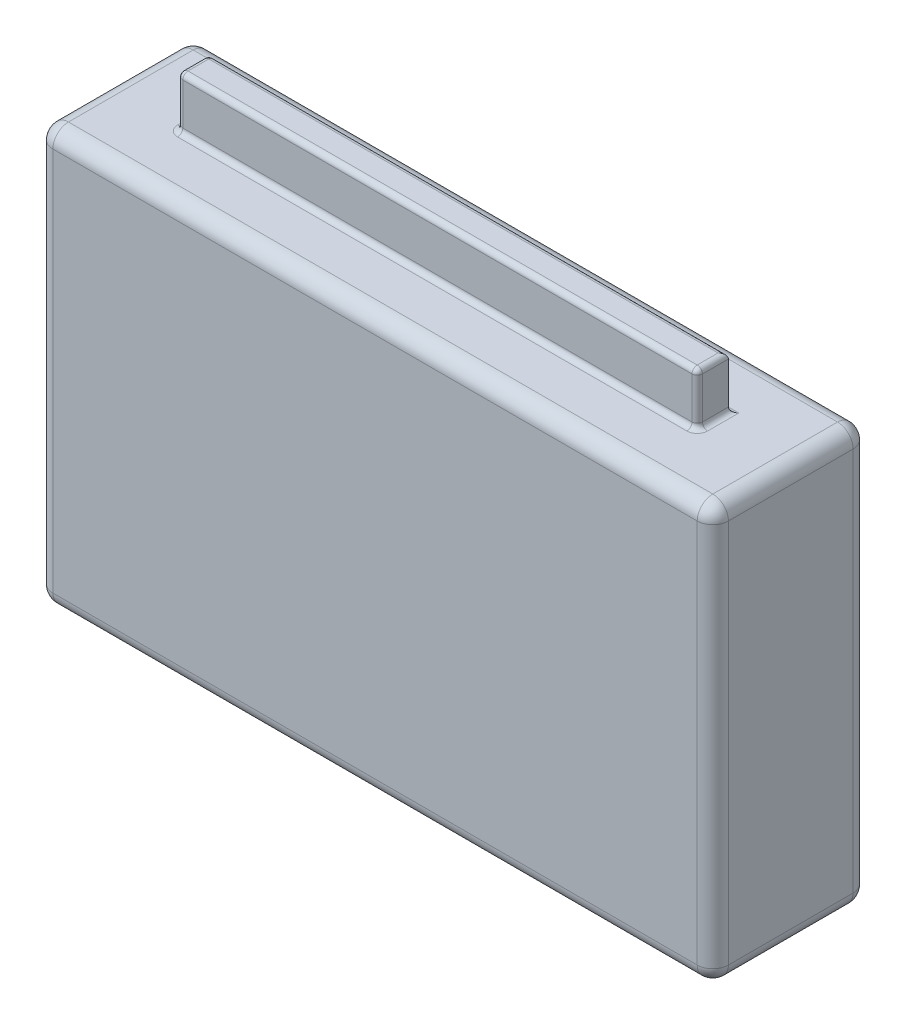
ISO-10303-21;
HEADER;
FILE_DESCRIPTION(('STEP AP214'),'2;1');
FILE_NAME('part.step','',(''),(''),'','','');
FILE_SCHEMA(('AUTOMOTIVE_DESIGN { 1 0 10303 214 1 1 1 1 }'));
ENDSEC;
DATA;
#1=APPLICATION_CONTEXT('core data for automotive mechanical design processes');
#2=APPLICATION_PROTOCOL_DEFINITION('international standard','automotive_design',2000,#1);
#3=PRODUCT_CONTEXT('',#1,'mechanical');
#4=PRODUCT('Part','Part','',(#3));
#5=PRODUCT_RELATED_PRODUCT_CATEGORY('part','',(#4));
#6=PRODUCT_DEFINITION_FORMATION('','',#4);
#7=PRODUCT_DEFINITION_CONTEXT('part definition',#1,'design');
#8=PRODUCT_DEFINITION('design','',#6,#7);
#9=PRODUCT_DEFINITION_SHAPE('','',#8);
#10=(LENGTH_UNIT() NAMED_UNIT(*) SI_UNIT(.MILLI.,.METRE.));
#11=(NAMED_UNIT(*) PLANE_ANGLE_UNIT() SI_UNIT($,.RADIAN.));
#12=(NAMED_UNIT(*) SI_UNIT($,.STERADIAN.) SOLID_ANGLE_UNIT());
#13=UNCERTAINTY_MEASURE_WITH_UNIT(LENGTH_MEASURE(1.E-05),#10,'distance_accuracy_value','');
#14=(GEOMETRIC_REPRESENTATION_CONTEXT(3) GLOBAL_UNCERTAINTY_ASSIGNED_CONTEXT((#13)) GLOBAL_UNIT_ASSIGNED_CONTEXT((#10,
#11,#12)) REPRESENTATION_CONTEXT('',''));
#15=CARTESIAN_POINT('',(0.,0.,0.));
#16=DIRECTION('',(0.,0.,1.));
#17=DIRECTION('',(1.,0.,0.));
#18=AXIS2_PLACEMENT_3D('',#15,#16,#17);
#19=CARTESIAN_POINT('',(650.,400.,300.));
#20=DIRECTION('',(0.,-1.,0.));
#21=DIRECTION('',(1.,0.,0.));
#22=AXIS2_PLACEMENT_3D('',#19,#20,#21);
#23=PLANE('',#22);
#24=DIRECTION('',(-1.,0.,0.));
#25=VECTOR('',#24,1.);
#26=CARTESIAN_POINT('',(650.,400.,270.));
#27=LINE('',#26,#25);
#28=CARTESIAN_POINT('',(-620.,400.,270.));
#29=VERTEX_POINT('',#28);
#30=CARTESIAN_POINT('',(620.,400.,270.));
#31=VERTEX_POINT('',#30);
#32=EDGE_CURVE('E275',#29,#31,#27,.F.);
#33=ORIENTED_EDGE('',*,*,#32,.T.);
#34=DIRECTION('',(0.,0.,-1.));
#35=VECTOR('',#34,1.);
#36=CARTESIAN_POINT('',(620.,400.,300.));
#37=LINE('',#36,#35);
#38=CARTESIAN_POINT('',(620.,400.,30.));
#39=VERTEX_POINT('',#38);
#40=EDGE_CURVE('E281',#31,#39,#37,.T.);
#41=ORIENTED_EDGE('',*,*,#40,.T.);
#42=DIRECTION('',(-1.,0.,0.));
#43=VECTOR('',#42,1.);
#44=CARTESIAN_POINT('',(650.,400.,30.));
#45=LINE('',#44,#43);
#46=CARTESIAN_POINT('',(-620.,400.,30.));
#47=VERTEX_POINT('',#46);
#48=EDGE_CURVE('E279',#39,#47,#45,.T.);
#49=ORIENTED_EDGE('',*,*,#48,.T.);
#50=DIRECTION('',(0.,0.,-1.));
#51=VECTOR('',#50,1.);
#52=CARTESIAN_POINT('',(-620.,400.,300.));
#53=LINE('',#52,#51);
#54=EDGE_CURVE('E277',#47,#29,#53,.F.);
#55=ORIENTED_EDGE('',*,*,#54,.T.);
#56=EDGE_LOOP('',(#33,#41,#49,#55));
#57=FACE_BOUND('',#56,.T.);
#58=CARTESIAN_POINT('',(-490.,400.,130.));
#59=DIRECTION('',(0.,-1.,0.));
#60=DIRECTION('',(1.,0.,0.));
#61=AXIS2_PLACEMENT_3D('',#58,#59,#60);
#62=CIRCLE('',#61,20.);
#63=CARTESIAN_POINT('',(-490.,400.,110.));
#64=VERTEX_POINT('',#63);
#65=CARTESIAN_POINT('',(-510.,400.,130.));
#66=VERTEX_POINT('',#65);
#67=EDGE_CURVE('E360',#64,#66,#62,.F.);
#68=ORIENTED_EDGE('',*,*,#67,.F.);
#69=DIRECTION('',(-1.,0.,0.));
#70=VECTOR('',#69,1.);
#71=CARTESIAN_POINT('',(500.,400.,110.));
#72=LINE('',#71,#70);
#73=CARTESIAN_POINT('',(510.,400.,110.));
#74=VERTEX_POINT('',#73);
#75=EDGE_CURVE('E357',#64,#74,#72,.F.);
#76=ORIENTED_EDGE('',*,*,#75,.T.);
#77=DIRECTION('',(0.,0.,-1.));
#78=VECTOR('',#77,1.);
#79=CARTESIAN_POINT('',(510.,400.,180.));
#80=LINE('',#79,#78);
#81=CARTESIAN_POINT('',(510.,400.,170.));
#82=VERTEX_POINT('',#81);
#83=EDGE_CURVE('E355',#74,#82,#80,.F.);
#84=ORIENTED_EDGE('',*,*,#83,.T.);
#85=CARTESIAN_POINT('',(490.,400.,170.));
#86=DIRECTION('',(0.,-1.,0.));
#87=DIRECTION('',(1.,0.,0.));
#88=AXIS2_PLACEMENT_3D('',#85,#86,#87);
#89=CIRCLE('',#88,20.);
#90=CARTESIAN_POINT('',(490.,400.,190.));
#91=VERTEX_POINT('',#90);
#92=EDGE_CURVE('E352',#91,#82,#89,.F.);
#93=ORIENTED_EDGE('',*,*,#92,.F.);
#94=DIRECTION('',(1.,0.,0.));
#95=VECTOR('',#94,1.);
#96=CARTESIAN_POINT('',(-500.,400.,190.));
#97=LINE('',#96,#95);
#98=CARTESIAN_POINT('',(-490.,400.,190.));
#99=VERTEX_POINT('',#98);
#100=EDGE_CURVE('E348',#91,#99,#97,.F.);
#101=ORIENTED_EDGE('',*,*,#100,.T.);
#102=CARTESIAN_POINT('',(-490.,400.,170.));
#103=DIRECTION('',(0.,-1.,0.));
#104=DIRECTION('',(1.,0.,0.));
#105=AXIS2_PLACEMENT_3D('',#102,#103,#104);
#106=CIRCLE('',#105,20.);
#107=CARTESIAN_POINT('',(-510.,400.,170.));
#108=VERTEX_POINT('',#107);
#109=EDGE_CURVE('E345',#108,#99,#106,.F.);
#110=ORIENTED_EDGE('',*,*,#109,.F.);
#111=DIRECTION('',(0.,0.,1.));
#112=VECTOR('',#111,1.);
#113=CARTESIAN_POINT('',(-510.,400.,120.));
#114=LINE('',#113,#112);
#115=EDGE_CURVE('E350',#108,#66,#114,.F.);
#116=ORIENTED_EDGE('',*,*,#115,.T.);
#117=EDGE_LOOP('',(#68,#76,#84,#93,#101,#110,#116));
#118=FACE_BOUND('',#117,.T.);
#119=ADVANCED_FACE('F37',(#57,#118),#23,.F.);
#120=CARTESIAN_POINT('',(-650.,-400.,300.));
#121=DIRECTION('',(1.,0.,0.));
#122=DIRECTION('',(0.,0.,-1.));
#123=AXIS2_PLACEMENT_3D('',#120,#121,#122);
#124=PLANE('',#123);
#125=DIRECTION('',(0.,0.,-1.));
#126=VECTOR('',#125,1.);
#127=CARTESIAN_POINT('',(-650.,370.,300.));
#128=LINE('',#127,#126);
#129=CARTESIAN_POINT('',(-650.,370.,270.));
#130=VERTEX_POINT('',#129);
#131=CARTESIAN_POINT('',(-650.,370.,30.));
#132=VERTEX_POINT('',#131);
#133=EDGE_CURVE('E248',#130,#132,#128,.T.);
#134=ORIENTED_EDGE('',*,*,#133,.T.);
#135=DIRECTION('',(0.,-1.,0.));
#136=VECTOR('',#135,1.);
#137=CARTESIAN_POINT('',(-650.,-400.,30.));
#138=LINE('',#137,#136);
#139=CARTESIAN_POINT('',(-650.,-370.,30.));
#140=VERTEX_POINT('',#139);
#141=EDGE_CURVE('E254',#132,#140,#138,.T.);
#142=ORIENTED_EDGE('',*,*,#141,.T.);
#143=DIRECTION('',(0.,0.,-1.));
#144=VECTOR('',#143,1.);
#145=CARTESIAN_POINT('',(-650.,-370.,300.));
#146=LINE('',#145,#144);
#147=CARTESIAN_POINT('',(-650.,-370.,270.));
#148=VERTEX_POINT('',#147);
#149=EDGE_CURVE('E252',#140,#148,#146,.F.);
#150=ORIENTED_EDGE('',*,*,#149,.T.);
#151=DIRECTION('',(0.,-1.,0.));
#152=VECTOR('',#151,1.);
#153=CARTESIAN_POINT('',(-650.,400.,270.));
#154=LINE('',#153,#152);
#155=EDGE_CURVE('E250',#148,#130,#154,.F.);
#156=ORIENTED_EDGE('',*,*,#155,.T.);
#157=EDGE_LOOP('',(#134,#142,#150,#156));
#158=FACE_BOUND('',#157,.T.);
#159=ADVANCED_FACE('F507',(#158),#124,.F.);
#160=CARTESIAN_POINT('',(650.,-400.,300.));
#161=DIRECTION('',(0.,1.,0.));
#162=DIRECTION('',(-1.,0.,0.));
#163=AXIS2_PLACEMENT_3D('',#160,#161,#162);
#164=PLANE('',#163);
#165=DIRECTION('',(0.,0.,-1.));
#166=VECTOR('',#165,1.);
#167=CARTESIAN_POINT('',(-620.,-400.,300.));
#168=LINE('',#167,#166);
#169=CARTESIAN_POINT('',(-620.,-400.,270.));
#170=VERTEX_POINT('',#169);
#171=CARTESIAN_POINT('',(-620.,-400.,30.));
#172=VERTEX_POINT('',#171);
#173=EDGE_CURVE('E235',#170,#172,#168,.T.);
#174=ORIENTED_EDGE('',*,*,#173,.T.);
#175=DIRECTION('',(1.,0.,0.));
#176=VECTOR('',#175,1.);
#177=CARTESIAN_POINT('',(650.,-400.,30.));
#178=LINE('',#177,#176);
#179=CARTESIAN_POINT('',(620.,-400.,30.));
#180=VERTEX_POINT('',#179);
#181=EDGE_CURVE('E205',#172,#180,#178,.T.);
#182=ORIENTED_EDGE('',*,*,#181,.T.);
#183=DIRECTION('',(0.,0.,-1.));
#184=VECTOR('',#183,1.);
#185=CARTESIAN_POINT('',(620.,-400.,300.));
#186=LINE('',#185,#184);
#187=CARTESIAN_POINT('',(620.,-400.,270.));
#188=VERTEX_POINT('',#187);
#189=EDGE_CURVE('E224',#180,#188,#186,.F.);
#190=ORIENTED_EDGE('',*,*,#189,.T.);
#191=DIRECTION('',(1.,0.,0.));
#192=VECTOR('',#191,1.);
#193=CARTESIAN_POINT('',(-650.,-400.,270.));
#194=LINE('',#193,#192);
#195=EDGE_CURVE('E230',#188,#170,#194,.F.);
#196=ORIENTED_EDGE('',*,*,#195,.T.);
#197=EDGE_LOOP('',(#174,#182,#190,#196));
#198=FACE_BOUND('',#197,.T.);
#199=ADVANCED_FACE('F233',(#198),#164,.F.);
#200=CARTESIAN_POINT('',(650.,-400.,300.));
#201=DIRECTION('',(-1.,0.,0.));
#202=DIRECTION('',(0.,0.,1.));
#203=AXIS2_PLACEMENT_3D('',#200,#201,#202);
#204=PLANE('',#203);
#205=DIRECTION('',(0.,0.,-1.));
#206=VECTOR('',#205,1.);
#207=CARTESIAN_POINT('',(650.,-370.,300.));
#208=LINE('',#207,#206);
#209=CARTESIAN_POINT('',(650.,-370.,270.));
#210=VERTEX_POINT('',#209);
#211=CARTESIAN_POINT('',(650.,-370.,30.));
#212=VERTEX_POINT('',#211);
#213=EDGE_CURVE('E270',#210,#212,#208,.T.);
#214=ORIENTED_EDGE('',*,*,#213,.T.);
#215=DIRECTION('',(0.,1.,0.));
#216=VECTOR('',#215,1.);
#217=CARTESIAN_POINT('',(650.,-400.,30.));
#218=LINE('',#217,#216);
#219=CARTESIAN_POINT('',(650.,370.,30.));
#220=VERTEX_POINT('',#219);
#221=EDGE_CURVE('E272',#212,#220,#218,.T.);
#222=ORIENTED_EDGE('',*,*,#221,.T.);
#223=DIRECTION('',(0.,0.,-1.));
#224=VECTOR('',#223,1.);
#225=CARTESIAN_POINT('',(650.,370.,300.));
#226=LINE('',#225,#224);
#227=CARTESIAN_POINT('',(650.,370.,270.));
#228=VERTEX_POINT('',#227);
#229=EDGE_CURVE('E266',#220,#228,#226,.F.);
#230=ORIENTED_EDGE('',*,*,#229,.T.);
#231=DIRECTION('',(0.,1.,0.));
#232=VECTOR('',#231,1.);
#233=CARTESIAN_POINT('',(650.,-400.,270.));
#234=LINE('',#233,#232);
#235=EDGE_CURVE('E268',#228,#210,#234,.F.);
#236=ORIENTED_EDGE('',*,*,#235,.T.);
#237=EDGE_LOOP('',(#214,#222,#230,#236));
#238=FACE_BOUND('',#237,.T.);
#239=ADVANCED_FACE('F486',(#238),#204,.F.);
#240=CARTESIAN_POINT('',(0.,0.,300.));
#241=DIRECTION('',(0.,0.,1.));
#242=DIRECTION('',(1.,0.,0.));
#243=AXIS2_PLACEMENT_3D('',#240,#241,#242);
#244=PLANE('',#243);
#245=DIRECTION('',(0.,-1.,0.));
#246=VECTOR('',#245,1.);
#247=CARTESIAN_POINT('',(-620.,-400.,300.));
#248=LINE('',#247,#246);
#249=CARTESIAN_POINT('',(-620.,370.,300.));
#250=VERTEX_POINT('',#249);
#251=CARTESIAN_POINT('',(-620.,-370.,300.));
#252=VERTEX_POINT('',#251);
#253=EDGE_CURVE('E261',#250,#252,#248,.T.);
#254=ORIENTED_EDGE('',*,*,#253,.T.);
#255=DIRECTION('',(1.,0.,0.));
#256=VECTOR('',#255,1.);
#257=CARTESIAN_POINT('',(650.,-370.,300.));
#258=LINE('',#257,#256);
#259=CARTESIAN_POINT('',(620.,-370.,300.));
#260=VERTEX_POINT('',#259);
#261=EDGE_CURVE('E263',#252,#260,#258,.T.);
#262=ORIENTED_EDGE('',*,*,#261,.T.);
#263=DIRECTION('',(0.,1.,0.));
#264=VECTOR('',#263,1.);
#265=CARTESIAN_POINT('',(620.,400.,300.));
#266=LINE('',#265,#264);
#267=CARTESIAN_POINT('',(620.,370.,300.));
#268=VERTEX_POINT('',#267);
#269=EDGE_CURVE('E259',#260,#268,#266,.T.);
#270=ORIENTED_EDGE('',*,*,#269,.T.);
#271=DIRECTION('',(-1.,0.,0.));
#272=VECTOR('',#271,1.);
#273=CARTESIAN_POINT('',(-650.,370.,300.));
#274=LINE('',#273,#272);
#275=EDGE_CURVE('E257',#268,#250,#274,.T.);
#276=ORIENTED_EDGE('',*,*,#275,.T.);
#277=EDGE_LOOP('',(#254,#262,#270,#276));
#278=FACE_BOUND('',#277,.T.);
#279=ADVANCED_FACE('F521',(#278),#244,.T.);
#280=CARTESIAN_POINT('',(0.,0.,0.));
#281=DIRECTION('',(0.,0.,1.));
#282=DIRECTION('',(1.,0.,0.));
#283=AXIS2_PLACEMENT_3D('',#280,#281,#282);
#284=PLANE('',#283);
#285=DIRECTION('',(0.,1.,0.));
#286=VECTOR('',#285,1.);
#287=CARTESIAN_POINT('',(620.,0.,0.));
#288=LINE('',#287,#286);
#289=CARTESIAN_POINT('',(620.,370.,0.));
#290=VERTEX_POINT('',#289);
#291=CARTESIAN_POINT('',(620.,-370.,0.));
#292=VERTEX_POINT('',#291);
#293=EDGE_CURVE('E239',#290,#292,#288,.F.);
#294=ORIENTED_EDGE('',*,*,#293,.T.);
#295=DIRECTION('',(1.,0.,0.));
#296=VECTOR('',#295,1.);
#297=CARTESIAN_POINT('',(0.,-370.,0.));
#298=LINE('',#297,#296);
#299=CARTESIAN_POINT('',(-620.,-370.,0.));
#300=VERTEX_POINT('',#299);
#301=EDGE_CURVE('E207',#292,#300,#298,.F.);
#302=ORIENTED_EDGE('',*,*,#301,.T.);
#303=DIRECTION('',(0.,-1.,0.));
#304=VECTOR('',#303,1.);
#305=CARTESIAN_POINT('',(-620.,0.,0.));
#306=LINE('',#305,#304);
#307=CARTESIAN_POINT('',(-620.,370.,0.));
#308=VERTEX_POINT('',#307);
#309=EDGE_CURVE('E245',#300,#308,#306,.F.);
#310=ORIENTED_EDGE('',*,*,#309,.T.);
#311=DIRECTION('',(-1.,0.,0.));
#312=VECTOR('',#311,1.);
#313=CARTESIAN_POINT('',(0.,370.,0.));
#314=LINE('',#313,#312);
#315=EDGE_CURVE('E237',#308,#290,#314,.F.);
#316=ORIENTED_EDGE('',*,*,#315,.T.);
#317=EDGE_LOOP('',(#294,#302,#310,#316));
#318=FACE_BOUND('',#317,.T.);
#319=ADVANCED_FACE('F478',(#318),#284,.F.);
#320=CARTESIAN_POINT('',(0.,370.,270.));
#321=DIRECTION('',(1.,0.,0.));
#322=DIRECTION('',(0.,1.,0.));
#323=AXIS2_PLACEMENT_3D('',#320,#321,#322);
#324=CYLINDRICAL_SURFACE('',#323,30.);
#325=CARTESIAN_POINT('',(-620.,370.,270.));
#326=DIRECTION('',(-1.,0.,0.));
#327=DIRECTION('',(0.,0.,1.));
#328=AXIS2_PLACEMENT_3D('',#325,#326,#327);
#329=CIRCLE('',#328,30.);
#330=EDGE_CURVE('E231',#250,#29,#329,.T.);
#331=ORIENTED_EDGE('',*,*,#330,.F.);
#332=ORIENTED_EDGE('',*,*,#275,.F.);
#333=CARTESIAN_POINT('',(620.,370.,270.));
#334=DIRECTION('',(1.,0.,0.));
#335=DIRECTION('',(0.,0.,-1.));
#336=AXIS2_PLACEMENT_3D('',#333,#334,#335);
#337=CIRCLE('',#336,30.);
#338=EDGE_CURVE('E334',#31,#268,#337,.T.);
#339=ORIENTED_EDGE('',*,*,#338,.F.);
#340=ORIENTED_EDGE('',*,*,#32,.F.);
#341=EDGE_LOOP('',(#331,#332,#339,#340));
#342=FACE_BOUND('',#341,.T.);
#343=ADVANCED_FACE('F889',(#342),#324,.T.);
#344=CARTESIAN_POINT('',(-620.,370.,270.));
#345=DIRECTION('',(0.,0.,1.));
#346=DIRECTION('',(1.,0.,0.));
#347=AXIS2_PLACEMENT_3D('',#344,#345,#346);
#348=SPHERICAL_SURFACE('',#347,30.);
#349=CARTESIAN_POINT('',(-620.,370.,270.));
#350=DIRECTION('',(0.,1.,0.));
#351=DIRECTION('',(0.,0.,1.));
#352=AXIS2_PLACEMENT_3D('',#349,#350,#351);
#353=CIRCLE('',#352,30.);
#354=EDGE_CURVE('E328',#250,#130,#353,.F.);
#355=ORIENTED_EDGE('',*,*,#354,.F.);
#356=ORIENTED_EDGE('',*,*,#330,.T.);
#357=CARTESIAN_POINT('',(-620.,370.,270.));
#358=DIRECTION('',(0.,0.,1.));
#359=DIRECTION('',(1.,0.,0.));
#360=AXIS2_PLACEMENT_3D('',#357,#358,#359);
#361=CIRCLE('',#360,30.);
#362=EDGE_CURVE('E331',#130,#29,#361,.F.);
#363=ORIENTED_EDGE('',*,*,#362,.F.);
#364=EDGE_LOOP('',(#355,#356,#363));
#365=FACE_BOUND('',#364,.T.);
#366=ADVANCED_FACE('F880',(#365),#348,.T.);
#367=CARTESIAN_POINT('',(620.,370.,270.));
#368=DIRECTION('',(0.,0.,1.));
#369=DIRECTION('',(1.,0.,0.));
#370=AXIS2_PLACEMENT_3D('',#367,#368,#369);
#371=SPHERICAL_SURFACE('',#370,30.);
#372=CARTESIAN_POINT('',(620.,370.,270.));
#373=DIRECTION('',(0.,0.,1.));
#374=DIRECTION('',(1.,0.,0.));
#375=AXIS2_PLACEMENT_3D('',#372,#373,#374);
#376=CIRCLE('',#375,30.);
#377=EDGE_CURVE('E322',#31,#228,#376,.F.);
#378=ORIENTED_EDGE('',*,*,#377,.F.);
#379=ORIENTED_EDGE('',*,*,#338,.T.);
#380=CARTESIAN_POINT('',(620.,370.,270.));
#381=DIRECTION('',(0.,1.,0.));
#382=DIRECTION('',(0.,0.,1.));
#383=AXIS2_PLACEMENT_3D('',#380,#381,#382);
#384=CIRCLE('',#383,30.);
#385=EDGE_CURVE('E325',#228,#268,#384,.F.);
#386=ORIENTED_EDGE('',*,*,#385,.F.);
#387=EDGE_LOOP('',(#378,#379,#386));
#388=FACE_BOUND('',#387,.T.);
#389=ADVANCED_FACE('F871',(#388),#371,.T.);
#390=CARTESIAN_POINT('',(-620.,370.,300.));
#391=DIRECTION('',(0.,0.,-1.));
#392=DIRECTION('',(-1.,0.,0.));
#393=AXIS2_PLACEMENT_3D('',#390,#391,#392);
#394=CYLINDRICAL_SURFACE('',#393,30.);
#395=ORIENTED_EDGE('',*,*,#362,.T.);
#396=ORIENTED_EDGE('',*,*,#54,.F.);
#397=CARTESIAN_POINT('',(-620.,370.,30.));
#398=DIRECTION('',(0.,0.,-1.));
#399=DIRECTION('',(-1.,0.,0.));
#400=AXIS2_PLACEMENT_3D('',#397,#398,#399);
#401=CIRCLE('',#400,30.);
#402=EDGE_CURVE('E316',#132,#47,#401,.T.);
#403=ORIENTED_EDGE('',*,*,#402,.F.);
#404=ORIENTED_EDGE('',*,*,#133,.F.);
#405=EDGE_LOOP('',(#395,#396,#403,#404));
#406=FACE_BOUND('',#405,.T.);
#407=ADVANCED_FACE('F862',(#406),#394,.T.);
#408=CARTESIAN_POINT('',(-620.,0.,270.));
#409=DIRECTION('',(0.,1.,0.));
#410=DIRECTION('',(0.,0.,1.));
#411=AXIS2_PLACEMENT_3D('',#408,#409,#410);
#412=CYLINDRICAL_SURFACE('',#411,30.);
#413=ORIENTED_EDGE('',*,*,#354,.T.);
#414=ORIENTED_EDGE('',*,*,#155,.F.);
#415=CARTESIAN_POINT('',(-620.,-370.,270.));
#416=DIRECTION('',(0.,-1.,0.));
#417=DIRECTION('',(0.,0.,-1.));
#418=AXIS2_PLACEMENT_3D('',#415,#416,#417);
#419=CIRCLE('',#418,30.);
#420=EDGE_CURVE('E313',#252,#148,#419,.T.);
#421=ORIENTED_EDGE('',*,*,#420,.F.);
#422=ORIENTED_EDGE('',*,*,#253,.F.);
#423=EDGE_LOOP('',(#413,#414,#421,#422));
#424=FACE_BOUND('',#423,.T.);
#425=ADVANCED_FACE('F854',(#424),#412,.T.);
#426=CARTESIAN_POINT('',(0.,-370.,270.));
#427=DIRECTION('',(-1.,0.,0.));
#428=DIRECTION('',(0.,-1.,0.));
#429=AXIS2_PLACEMENT_3D('',#426,#427,#428);
#430=CYLINDRICAL_SURFACE('',#429,30.);
#431=CARTESIAN_POINT('',(620.,-370.,270.));
#432=DIRECTION('',(1.,0.,0.));
#433=DIRECTION('',(0.,0.,-1.));
#434=AXIS2_PLACEMENT_3D('',#431,#432,#433);
#435=CIRCLE('',#434,30.);
#436=EDGE_CURVE('E307',#260,#188,#435,.T.);
#437=ORIENTED_EDGE('',*,*,#436,.F.);
#438=ORIENTED_EDGE('',*,*,#261,.F.);
#439=CARTESIAN_POINT('',(-620.,-370.,270.));
#440=DIRECTION('',(-1.,0.,0.));
#441=DIRECTION('',(0.,0.,1.));
#442=AXIS2_PLACEMENT_3D('',#439,#440,#441);
#443=CIRCLE('',#442,30.);
#444=EDGE_CURVE('E310',#170,#252,#443,.T.);
#445=ORIENTED_EDGE('',*,*,#444,.F.);
#446=ORIENTED_EDGE('',*,*,#195,.F.);
#447=EDGE_LOOP('',(#437,#438,#445,#446));
#448=FACE_BOUND('',#447,.T.);
#449=ADVANCED_FACE('F460',(#448),#430,.T.);
#450=CARTESIAN_POINT('',(620.,0.,270.));
#451=DIRECTION('',(0.,-1.,0.));
#452=DIRECTION('',(0.,0.,-1.));
#453=AXIS2_PLACEMENT_3D('',#450,#451,#452);
#454=CYLINDRICAL_SURFACE('',#453,30.);
#455=ORIENTED_EDGE('',*,*,#385,.T.);
#456=ORIENTED_EDGE('',*,*,#269,.F.);
#457=CARTESIAN_POINT('',(620.,-370.,270.));
#458=DIRECTION('',(0.,-1.,0.));
#459=DIRECTION('',(0.,0.,-1.));
#460=AXIS2_PLACEMENT_3D('',#457,#458,#459);
#461=CIRCLE('',#460,30.);
#462=EDGE_CURVE('E305',#210,#260,#461,.T.);
#463=ORIENTED_EDGE('',*,*,#462,.F.);
#464=ORIENTED_EDGE('',*,*,#235,.F.);
#465=EDGE_LOOP('',(#455,#456,#463,#464));
#466=FACE_BOUND('',#465,.T.);
#467=ADVANCED_FACE('F492',(#466),#454,.T.);
#468=CARTESIAN_POINT('',(620.,370.,300.));
#469=DIRECTION('',(0.,0.,-1.));
#470=DIRECTION('',(-1.,0.,0.));
#471=AXIS2_PLACEMENT_3D('',#468,#469,#470);
#472=CYLINDRICAL_SURFACE('',#471,30.);
#473=ORIENTED_EDGE('',*,*,#377,.T.);
#474=ORIENTED_EDGE('',*,*,#229,.F.);
#475=CARTESIAN_POINT('',(620.,370.,30.));
#476=DIRECTION('',(0.,0.,-1.));
#477=DIRECTION('',(-1.,0.,0.));
#478=AXIS2_PLACEMENT_3D('',#475,#476,#477);
#479=CIRCLE('',#478,30.);
#480=EDGE_CURVE('E302',#39,#220,#479,.T.);
#481=ORIENTED_EDGE('',*,*,#480,.F.);
#482=ORIENTED_EDGE('',*,*,#40,.F.);
#483=EDGE_LOOP('',(#473,#474,#481,#482));
#484=FACE_BOUND('',#483,.T.);
#485=ADVANCED_FACE('F830',(#484),#472,.T.);
#486=CARTESIAN_POINT('',(650.,370.,30.));
#487=DIRECTION('',(-1.,0.,0.));
#488=DIRECTION('',(0.,-1.,0.));
#489=AXIS2_PLACEMENT_3D('',#486,#487,#488);
#490=CYLINDRICAL_SURFACE('',#489,30.);
#491=CARTESIAN_POINT('',(-620.,370.,30.));
#492=DIRECTION('',(-1.,0.,0.));
#493=DIRECTION('',(0.,0.,1.));
#494=AXIS2_PLACEMENT_3D('',#491,#492,#493);
#495=CIRCLE('',#494,30.);
#496=EDGE_CURVE('E319',#47,#308,#495,.T.);
#497=ORIENTED_EDGE('',*,*,#496,.F.);
#498=ORIENTED_EDGE('',*,*,#48,.F.);
#499=CARTESIAN_POINT('',(620.,370.,30.));
#500=DIRECTION('',(1.,0.,0.));
#501=DIRECTION('',(0.,0.,-1.));
#502=AXIS2_PLACEMENT_3D('',#499,#500,#501);
#503=CIRCLE('',#502,30.);
#504=EDGE_CURVE('E300',#290,#39,#503,.T.);
#505=ORIENTED_EDGE('',*,*,#504,.F.);
#506=ORIENTED_EDGE('',*,*,#315,.F.);
#507=EDGE_LOOP('',(#497,#498,#505,#506));
#508=FACE_BOUND('',#507,.T.);
#509=ADVANCED_FACE('F821',(#508),#490,.T.);
#510=CARTESIAN_POINT('',(-620.,370.,30.));
#511=DIRECTION('',(0.,0.,1.));
#512=DIRECTION('',(1.,0.,0.));
#513=AXIS2_PLACEMENT_3D('',#510,#511,#512);
#514=SPHERICAL_SURFACE('',#513,30.);
#515=ORIENTED_EDGE('',*,*,#402,.T.);
#516=ORIENTED_EDGE('',*,*,#496,.T.);
#517=CARTESIAN_POINT('',(-620.,370.,30.));
#518=DIRECTION('',(0.,1.,0.));
#519=DIRECTION('',(-1.,0.,0.));
#520=AXIS2_PLACEMENT_3D('',#517,#518,#519);
#521=CIRCLE('',#520,30.);
#522=EDGE_CURVE('E297',#132,#308,#521,.F.);
#523=ORIENTED_EDGE('',*,*,#522,.F.);
#524=EDGE_LOOP('',(#515,#516,#523));
#525=FACE_BOUND('',#524,.T.);
#526=ADVANCED_FACE('F504',(#525),#514,.T.);
#527=CARTESIAN_POINT('',(-620.,-370.,270.));
#528=DIRECTION('',(0.,0.,1.));
#529=DIRECTION('',(1.,0.,0.));
#530=AXIS2_PLACEMENT_3D('',#527,#528,#529);
#531=SPHERICAL_SURFACE('',#530,30.);
#532=ORIENTED_EDGE('',*,*,#444,.T.);
#533=ORIENTED_EDGE('',*,*,#420,.T.);
#534=CARTESIAN_POINT('',(-620.,-370.,270.));
#535=DIRECTION('',(0.,0.,1.));
#536=DIRECTION('',(1.,0.,0.));
#537=AXIS2_PLACEMENT_3D('',#534,#535,#536);
#538=CIRCLE('',#537,30.);
#539=EDGE_CURVE('E294',#170,#148,#538,.F.);
#540=ORIENTED_EDGE('',*,*,#539,.F.);
#541=EDGE_LOOP('',(#532,#533,#540));
#542=FACE_BOUND('',#541,.T.);
#543=ADVANCED_FACE('F463',(#542),#531,.T.);
#544=CARTESIAN_POINT('',(620.,-370.,270.));
#545=DIRECTION('',(0.,0.,1.));
#546=DIRECTION('',(1.,0.,0.));
#547=AXIS2_PLACEMENT_3D('',#544,#545,#546);
#548=SPHERICAL_SURFACE('',#547,30.);
#549=ORIENTED_EDGE('',*,*,#462,.T.);
#550=ORIENTED_EDGE('',*,*,#436,.T.);
#551=CARTESIAN_POINT('',(620.,-370.,270.));
#552=DIRECTION('',(0.,0.,1.));
#553=DIRECTION('',(1.,0.,0.));
#554=AXIS2_PLACEMENT_3D('',#551,#552,#553);
#555=CIRCLE('',#554,30.);
#556=EDGE_CURVE('E227',#210,#188,#555,.F.);
#557=ORIENTED_EDGE('',*,*,#556,.F.);
#558=EDGE_LOOP('',(#549,#550,#557));
#559=FACE_BOUND('',#558,.T.);
#560=ADVANCED_FACE('F494',(#559),#548,.T.);
#561=CARTESIAN_POINT('',(620.,370.,30.));
#562=DIRECTION('',(0.,0.,1.));
#563=DIRECTION('',(1.,0.,0.));
#564=AXIS2_PLACEMENT_3D('',#561,#562,#563);
#565=SPHERICAL_SURFACE('',#564,30.);
#566=ORIENTED_EDGE('',*,*,#504,.T.);
#567=ORIENTED_EDGE('',*,*,#480,.T.);
#568=CARTESIAN_POINT('',(620.,370.,30.));
#569=DIRECTION('',(0.,1.,0.));
#570=DIRECTION('',(0.,0.,1.));
#571=AXIS2_PLACEMENT_3D('',#568,#569,#570);
#572=CIRCLE('',#571,30.);
#573=EDGE_CURVE('E291',#290,#220,#572,.F.);
#574=ORIENTED_EDGE('',*,*,#573,.F.);
#575=EDGE_LOOP('',(#566,#567,#574));
#576=FACE_BOUND('',#575,.T.);
#577=ADVANCED_FACE('F496',(#576),#565,.T.);
#578=CARTESIAN_POINT('',(-620.,-400.,30.));
#579=DIRECTION('',(0.,-1.,0.));
#580=DIRECTION('',(0.,0.,-1.));
#581=AXIS2_PLACEMENT_3D('',#578,#579,#580);
#582=CYLINDRICAL_SURFACE('',#581,30.);
#583=ORIENTED_EDGE('',*,*,#522,.T.);
#584=ORIENTED_EDGE('',*,*,#309,.F.);
#585=CARTESIAN_POINT('',(-620.,-370.,30.));
#586=DIRECTION('',(0.,-1.,0.));
#587=DIRECTION('',(0.,0.,-1.));
#588=AXIS2_PLACEMENT_3D('',#585,#586,#587);
#589=CIRCLE('',#588,30.);
#590=EDGE_CURVE('E288',#140,#300,#589,.T.);
#591=ORIENTED_EDGE('',*,*,#590,.F.);
#592=ORIENTED_EDGE('',*,*,#141,.F.);
#593=EDGE_LOOP('',(#583,#584,#591,#592));
#594=FACE_BOUND('',#593,.T.);
#595=ADVANCED_FACE('F474',(#594),#582,.T.);
#596=CARTESIAN_POINT('',(-620.,-370.,300.));
#597=DIRECTION('',(0.,0.,-1.));
#598=DIRECTION('',(-1.,0.,0.));
#599=AXIS2_PLACEMENT_3D('',#596,#597,#598);
#600=CYLINDRICAL_SURFACE('',#599,30.);
#601=ORIENTED_EDGE('',*,*,#539,.T.);
#602=ORIENTED_EDGE('',*,*,#149,.F.);
#603=CARTESIAN_POINT('',(-620.,-370.,30.));
#604=DIRECTION('',(0.,0.,-1.));
#605=DIRECTION('',(-1.,0.,0.));
#606=AXIS2_PLACEMENT_3D('',#603,#604,#605);
#607=CIRCLE('',#606,30.);
#608=EDGE_CURVE('E221',#172,#140,#607,.T.);
#609=ORIENTED_EDGE('',*,*,#608,.F.);
#610=ORIENTED_EDGE('',*,*,#173,.F.);
#611=EDGE_LOOP('',(#601,#602,#609,#610));
#612=FACE_BOUND('',#611,.T.);
#613=ADVANCED_FACE('F466',(#612),#600,.T.);
#614=CARTESIAN_POINT('',(620.,-370.,300.));
#615=DIRECTION('',(0.,0.,-1.));
#616=DIRECTION('',(-1.,0.,0.));
#617=AXIS2_PLACEMENT_3D('',#614,#615,#616);
#618=CYLINDRICAL_SURFACE('',#617,30.);
#619=ORIENTED_EDGE('',*,*,#556,.T.);
#620=ORIENTED_EDGE('',*,*,#189,.F.);
#621=CARTESIAN_POINT('',(620.,-370.,30.));
#622=DIRECTION('',(0.,0.,-1.));
#623=DIRECTION('',(-1.,0.,0.));
#624=AXIS2_PLACEMENT_3D('',#621,#622,#623);
#625=CIRCLE('',#624,30.);
#626=EDGE_CURVE('E214',#212,#180,#625,.T.);
#627=ORIENTED_EDGE('',*,*,#626,.F.);
#628=ORIENTED_EDGE('',*,*,#213,.F.);
#629=EDGE_LOOP('',(#619,#620,#627,#628));
#630=FACE_BOUND('',#629,.T.);
#631=ADVANCED_FACE('F225',(#630),#618,.T.);
#632=CARTESIAN_POINT('',(620.,-400.,30.));
#633=DIRECTION('',(0.,1.,0.));
#634=DIRECTION('',(0.,0.,1.));
#635=AXIS2_PLACEMENT_3D('',#632,#633,#634);
#636=CYLINDRICAL_SURFACE('',#635,30.);
#637=ORIENTED_EDGE('',*,*,#573,.T.);
#638=ORIENTED_EDGE('',*,*,#221,.F.);
#639=CARTESIAN_POINT('',(620.,-370.,30.));
#640=DIRECTION('',(0.,-1.,0.));
#641=DIRECTION('',(0.,0.,-1.));
#642=AXIS2_PLACEMENT_3D('',#639,#640,#641);
#643=CIRCLE('',#642,30.);
#644=EDGE_CURVE('E218',#292,#212,#643,.T.);
#645=ORIENTED_EDGE('',*,*,#644,.F.);
#646=ORIENTED_EDGE('',*,*,#293,.F.);
#647=EDGE_LOOP('',(#637,#638,#645,#646));
#648=FACE_BOUND('',#647,.T.);
#649=ADVANCED_FACE('F483',(#648),#636,.T.);
#650=CARTESIAN_POINT('',(-620.,-370.,30.));
#651=DIRECTION('',(0.,0.,1.));
#652=DIRECTION('',(1.,0.,0.));
#653=AXIS2_PLACEMENT_3D('',#650,#651,#652);
#654=SPHERICAL_SURFACE('',#653,30.);
#655=ORIENTED_EDGE('',*,*,#608,.T.);
#656=ORIENTED_EDGE('',*,*,#590,.T.);
#657=CARTESIAN_POINT('',(-620.,-370.,30.));
#658=DIRECTION('',(-1.,0.,0.));
#659=DIRECTION('',(0.,0.,1.));
#660=AXIS2_PLACEMENT_3D('',#657,#658,#659);
#661=CIRCLE('',#660,30.);
#662=EDGE_CURVE('E210',#172,#300,#661,.F.);
#663=ORIENTED_EDGE('',*,*,#662,.F.);
#664=EDGE_LOOP('',(#655,#656,#663));
#665=FACE_BOUND('',#664,.T.);
#666=ADVANCED_FACE('F470',(#665),#654,.T.);
#667=CARTESIAN_POINT('',(620.,-370.,30.));
#668=DIRECTION('',(0.,0.,1.));
#669=DIRECTION('',(1.,0.,0.));
#670=AXIS2_PLACEMENT_3D('',#667,#668,#669);
#671=SPHERICAL_SURFACE('',#670,30.);
#672=ORIENTED_EDGE('',*,*,#644,.T.);
#673=ORIENTED_EDGE('',*,*,#626,.T.);
#674=CARTESIAN_POINT('',(620.,-370.,30.));
#675=DIRECTION('',(1.,0.,0.));
#676=DIRECTION('',(0.,0.,-1.));
#677=AXIS2_PLACEMENT_3D('',#674,#675,#676);
#678=CIRCLE('',#677,30.);
#679=EDGE_CURVE('E201',#292,#180,#678,.F.);
#680=ORIENTED_EDGE('',*,*,#679,.F.);
#681=EDGE_LOOP('',(#672,#673,#680));
#682=FACE_BOUND('',#681,.T.);
#683=ADVANCED_FACE('F216',(#682),#671,.T.);
#684=CARTESIAN_POINT('',(650.,-370.,30.));
#685=DIRECTION('',(1.,0.,0.));
#686=DIRECTION('',(0.,1.,0.));
#687=AXIS2_PLACEMENT_3D('',#684,#685,#686);
#688=CYLINDRICAL_SURFACE('',#687,30.);
#689=ORIENTED_EDGE('',*,*,#662,.T.);
#690=ORIENTED_EDGE('',*,*,#301,.F.);
#691=ORIENTED_EDGE('',*,*,#679,.T.);
#692=ORIENTED_EDGE('',*,*,#181,.F.);
#693=EDGE_LOOP('',(#689,#690,#691,#692));
#694=FACE_BOUND('',#693,.T.);
#695=ADVANCED_FACE('F203',(#694),#688,.T.);
#696=CARTESIAN_POINT('',(-500.,500.,120.));
#697=DIRECTION('',(1.,0.,0.));
#698=DIRECTION('',(0.,1.,0.));
#699=AXIS2_PLACEMENT_3D('',#696,#697,#698);
#700=PLANE('',#699);
#701=DIRECTION('',(0.,-1.,0.));
#702=VECTOR('',#701,1.);
#703=CARTESIAN_POINT('',(-500.,500.,130.));
#704=LINE('',#703,#702);
#705=CARTESIAN_POINT('',(-500.,490.,130.));
#706=VERTEX_POINT('',#705);
#707=CARTESIAN_POINT('',(-500.,410.,130.));
#708=VERTEX_POINT('',#707);
#709=EDGE_CURVE('E373',#706,#708,#704,.T.);
#710=ORIENTED_EDGE('',*,*,#709,.T.);
#711=DIRECTION('',(0.,0.,1.));
#712=VECTOR('',#711,1.);
#713=CARTESIAN_POINT('',(-500.,410.,180.));
#714=LINE('',#713,#712);
#715=CARTESIAN_POINT('',(-500.,410.,170.));
#716=VERTEX_POINT('',#715);
#717=EDGE_CURVE('E375',#708,#716,#714,.T.);
#718=ORIENTED_EDGE('',*,*,#717,.T.);
#719=DIRECTION('',(0.,-1.,0.));
#720=VECTOR('',#719,1.);
#721=CARTESIAN_POINT('',(-500.,500.,170.));
#722=LINE('',#721,#720);
#723=CARTESIAN_POINT('',(-500.,490.,170.));
#724=VERTEX_POINT('',#723);
#725=EDGE_CURVE('E369',#716,#724,#722,.F.);
#726=ORIENTED_EDGE('',*,*,#725,.T.);
#727=DIRECTION('',(0.,0.,1.));
#728=VECTOR('',#727,1.);
#729=CARTESIAN_POINT('',(-500.,490.,120.));
#730=LINE('',#729,#728);
#731=EDGE_CURVE('E371',#724,#706,#730,.F.);
#732=ORIENTED_EDGE('',*,*,#731,.T.);
#733=EDGE_LOOP('',(#710,#718,#726,#732));
#734=FACE_BOUND('',#733,.T.);
#735=ADVANCED_FACE('F526',(#734),#700,.F.);
#736=CARTESIAN_POINT('',(-500.,500.,180.));
#737=DIRECTION('',(0.,0.,-1.));
#738=DIRECTION('',(-1.,0.,0.));
#739=AXIS2_PLACEMENT_3D('',#736,#737,#738);
#740=PLANE('',#739);
#741=DIRECTION('',(0.,-1.,0.));
#742=VECTOR('',#741,1.);
#743=CARTESIAN_POINT('',(-490.,500.,180.));
#744=LINE('',#743,#742);
#745=CARTESIAN_POINT('',(-490.,490.,180.));
#746=VERTEX_POINT('',#745);
#747=CARTESIAN_POINT('',(-490.,410.,180.));
#748=VERTEX_POINT('',#747);
#749=EDGE_CURVE('E57',#746,#748,#744,.T.);
#750=ORIENTED_EDGE('',*,*,#749,.T.);
#751=DIRECTION('',(1.,0.,0.));
#752=VECTOR('',#751,1.);
#753=CARTESIAN_POINT('',(500.,410.,180.));
#754=LINE('',#753,#752);
#755=CARTESIAN_POINT('',(490.,410.,180.));
#756=VERTEX_POINT('',#755);
#757=EDGE_CURVE('E11',#748,#756,#754,.T.);
#758=ORIENTED_EDGE('',*,*,#757,.T.);
#759=DIRECTION('',(0.,-1.,0.));
#760=VECTOR('',#759,1.);
#761=CARTESIAN_POINT('',(490.,500.,180.));
#762=LINE('',#761,#760);
#763=CARTESIAN_POINT('',(490.,490.,180.));
#764=VERTEX_POINT('',#763);
#765=EDGE_CURVE('E46',#756,#764,#762,.F.);
#766=ORIENTED_EDGE('',*,*,#765,.T.);
#767=DIRECTION('',(1.,0.,0.));
#768=VECTOR('',#767,1.);
#769=CARTESIAN_POINT('',(-500.,490.,180.));
#770=LINE('',#769,#768);
#771=EDGE_CURVE('E387',#764,#746,#770,.F.);
#772=ORIENTED_EDGE('',*,*,#771,.T.);
#773=EDGE_LOOP('',(#750,#758,#766,#772));
#774=FACE_BOUND('',#773,.T.);
#775=ADVANCED_FACE('F572',(#774),#740,.F.);
#776=CARTESIAN_POINT('',(500.,500.,120.));
#777=DIRECTION('',(-1.,0.,0.));
#778=DIRECTION('',(0.,-1.,0.));
#779=AXIS2_PLACEMENT_3D('',#776,#777,#778);
#780=PLANE('',#779);
#781=DIRECTION('',(0.,-1.,0.));
#782=VECTOR('',#781,1.);
#783=CARTESIAN_POINT('',(500.,500.,170.));
#784=LINE('',#783,#782);
#785=CARTESIAN_POINT('',(500.,490.,170.));
#786=VERTEX_POINT('',#785);
#787=CARTESIAN_POINT('',(500.,410.,170.));
#788=VERTEX_POINT('',#787);
#789=EDGE_CURVE('E363',#786,#788,#784,.T.);
#790=ORIENTED_EDGE('',*,*,#789,.T.);
#791=DIRECTION('',(0.,0.,-1.));
#792=VECTOR('',#791,1.);
#793=CARTESIAN_POINT('',(500.,410.,120.));
#794=LINE('',#793,#792);
#795=CARTESIAN_POINT('',(500.,410.,120.));
#796=VERTEX_POINT('',#795);
#797=EDGE_CURVE('E367',#788,#796,#794,.T.);
#798=ORIENTED_EDGE('',*,*,#797,.T.);
#799=DIRECTION('',(0.,-1.,0.));
#800=VECTOR('',#799,1.);
#801=CARTESIAN_POINT('',(500.,500.,120.));
#802=LINE('',#801,#800);
#803=CARTESIAN_POINT('',(500.,490.,120.));
#804=VERTEX_POINT('',#803);
#805=EDGE_CURVE('E211',#804,#796,#802,.T.);
#806=ORIENTED_EDGE('',*,*,#805,.F.);
#807=DIRECTION('',(0.,0.,-1.));
#808=VECTOR('',#807,1.);
#809=CARTESIAN_POINT('',(500.,490.,180.));
#810=LINE('',#809,#808);
#811=EDGE_CURVE('E365',#804,#786,#810,.F.);
#812=ORIENTED_EDGE('',*,*,#811,.T.);
#813=EDGE_LOOP('',(#790,#798,#806,#812));
#814=FACE_BOUND('',#813,.T.);
#815=ADVANCED_FACE('F580',(#814),#780,.F.);
#816=CARTESIAN_POINT('',(-500.,500.,120.));
#817=DIRECTION('',(0.,0.,1.));
#818=DIRECTION('',(1.,0.,0.));
#819=AXIS2_PLACEMENT_3D('',#816,#817,#818);
#820=PLANE('',#819);
#821=ORIENTED_EDGE('',*,*,#805,.T.);
#822=DIRECTION('',(-1.,0.,0.));
#823=VECTOR('',#822,1.);
#824=CARTESIAN_POINT('',(-500.,410.,120.));
#825=LINE('',#824,#823);
#826=CARTESIAN_POINT('',(-490.,410.,120.));
#827=VERTEX_POINT('',#826);
#828=EDGE_CURVE('E342',#796,#827,#825,.T.);
#829=ORIENTED_EDGE('',*,*,#828,.T.);
#830=DIRECTION('',(0.,-1.,0.));
#831=VECTOR('',#830,1.);
#832=CARTESIAN_POINT('',(-490.,500.,120.));
#833=LINE('',#832,#831);
#834=CARTESIAN_POINT('',(-490.,490.,120.));
#835=VERTEX_POINT('',#834);
#836=EDGE_CURVE('E283',#827,#835,#833,.F.);
#837=ORIENTED_EDGE('',*,*,#836,.T.);
#838=DIRECTION('',(-1.,0.,0.));
#839=VECTOR('',#838,1.);
#840=CARTESIAN_POINT('',(500.,490.,120.));
#841=LINE('',#840,#839);
#842=EDGE_CURVE('E340',#835,#804,#841,.F.);
#843=ORIENTED_EDGE('',*,*,#842,.T.);
#844=EDGE_LOOP('',(#821,#829,#837,#843));
#845=FACE_BOUND('',#844,.T.);
#846=ADVANCED_FACE('F587',(#845),#820,.F.);
#847=CARTESIAN_POINT('',(0.,500.,0.));
#848=DIRECTION('',(0.,1.,0.));
#849=DIRECTION('',(-1.,0.,0.));
#850=AXIS2_PLACEMENT_3D('',#847,#848,#849);
#851=PLANE('',#850);
#852=DIRECTION('',(0.,0.,-1.));
#853=VECTOR('',#852,1.);
#854=CARTESIAN_POINT('',(490.,500.,120.));
#855=LINE('',#854,#853);
#856=CARTESIAN_POINT('',(490.,500.,170.));
#857=VERTEX_POINT('',#856);
#858=CARTESIAN_POINT('',(490.,500.,130.));
#859=VERTEX_POINT('',#858);
#860=EDGE_CURVE('E382',#857,#859,#855,.T.);
#861=ORIENTED_EDGE('',*,*,#860,.T.);
#862=DIRECTION('',(-1.,0.,0.));
#863=VECTOR('',#862,1.);
#864=CARTESIAN_POINT('',(-500.,500.,130.));
#865=LINE('',#864,#863);
#866=CARTESIAN_POINT('',(-490.,500.,130.));
#867=VERTEX_POINT('',#866);
#868=EDGE_CURVE('E384',#859,#867,#865,.T.);
#869=ORIENTED_EDGE('',*,*,#868,.T.);
#870=DIRECTION('',(0.,0.,1.));
#871=VECTOR('',#870,1.);
#872=CARTESIAN_POINT('',(-490.,500.,180.));
#873=LINE('',#872,#871);
#874=CARTESIAN_POINT('',(-490.,500.,170.));
#875=VERTEX_POINT('',#874);
#876=EDGE_CURVE('E380',#867,#875,#873,.T.);
#877=ORIENTED_EDGE('',*,*,#876,.T.);
#878=DIRECTION('',(1.,0.,0.));
#879=VECTOR('',#878,1.);
#880=CARTESIAN_POINT('',(500.,500.,170.));
#881=LINE('',#880,#879);
#882=EDGE_CURVE('E378',#875,#857,#881,.T.);
#883=ORIENTED_EDGE('',*,*,#882,.T.);
#884=EDGE_LOOP('',(#861,#869,#877,#883));
#885=FACE_BOUND('',#884,.T.);
#886=ADVANCED_FACE('F595',(#885),#851,.T.);
#887=CARTESIAN_POINT('',(0.,490.,170.));
#888=DIRECTION('',(-1.,0.,0.));
#889=DIRECTION('',(0.,-1.,0.));
#890=AXIS2_PLACEMENT_3D('',#887,#888,#889);
#891=CYLINDRICAL_SURFACE('',#890,10.);
#892=CARTESIAN_POINT('',(490.,490.,170.));
#893=DIRECTION('',(1.,0.,0.));
#894=DIRECTION('',(0.,0.,-1.));
#895=AXIS2_PLACEMENT_3D('',#892,#893,#894);
#896=CIRCLE('',#895,10.);
#897=EDGE_CURVE('E439',#857,#764,#896,.T.);
#898=ORIENTED_EDGE('',*,*,#897,.F.);
#899=ORIENTED_EDGE('',*,*,#882,.F.);
#900=CARTESIAN_POINT('',(-490.,490.,170.));
#901=DIRECTION('',(-1.,0.,0.));
#902=DIRECTION('',(0.,0.,1.));
#903=AXIS2_PLACEMENT_3D('',#900,#901,#902);
#904=CIRCLE('',#903,10.);
#905=EDGE_CURVE('E41',#746,#875,#904,.T.);
#906=ORIENTED_EDGE('',*,*,#905,.F.);
#907=ORIENTED_EDGE('',*,*,#771,.F.);
#908=EDGE_LOOP('',(#898,#899,#906,#907));
#909=FACE_BOUND('',#908,.T.);
#910=ADVANCED_FACE('F39',(#909),#891,.T.);
#911=CARTESIAN_POINT('',(490.,490.,0.));
#912=DIRECTION('',(0.,0.,1.));
#913=DIRECTION('',(1.,0.,0.));
#914=AXIS2_PLACEMENT_3D('',#911,#912,#913);
#915=CYLINDRICAL_SURFACE('',#914,10.);
#916=CARTESIAN_POINT('',(490.,490.,130.));
#917=DIRECTION('',(0.707106781186547,0.,0.707106781186547));
#918=DIRECTION('',(-0.707106781186547,0.,0.707106781186547));
#919=AXIS2_PLACEMENT_3D('',#916,#917,#918);
#920=ELLIPSE('',#919,14.1421356237309,10.);
#921=EDGE_CURVE('E434',#859,#804,#920,.F.);
#922=ORIENTED_EDGE('',*,*,#921,.F.);
#923=ORIENTED_EDGE('',*,*,#860,.F.);
#924=CARTESIAN_POINT('',(490.,490.,170.));
#925=DIRECTION('',(0.,0.,1.));
#926=DIRECTION('',(1.,0.,0.));
#927=AXIS2_PLACEMENT_3D('',#924,#925,#926);
#928=CIRCLE('',#927,10.);
#929=EDGE_CURVE('E437',#786,#857,#928,.T.);
#930=ORIENTED_EDGE('',*,*,#929,.F.);
#931=ORIENTED_EDGE('',*,*,#811,.F.);
#932=EDGE_LOOP('',(#922,#923,#930,#931));
#933=FACE_BOUND('',#932,.T.);
#934=ADVANCED_FACE('F609',(#933),#915,.T.);
#935=CARTESIAN_POINT('',(-490.,490.,170.));
#936=DIRECTION('',(0.,0.,1.));
#937=DIRECTION('',(1.,0.,0.));
#938=AXIS2_PLACEMENT_3D('',#935,#936,#937);
#939=SPHERICAL_SURFACE('',#938,10.);
#940=CARTESIAN_POINT('',(-490.,490.,170.));
#941=DIRECTION('',(0.,1.,0.));
#942=DIRECTION('',(0.,0.,1.));
#943=AXIS2_PLACEMENT_3D('',#940,#941,#942);
#944=CIRCLE('',#943,10.);
#945=EDGE_CURVE('E428',#746,#724,#944,.F.);
#946=ORIENTED_EDGE('',*,*,#945,.F.);
#947=ORIENTED_EDGE('',*,*,#905,.T.);
#948=CARTESIAN_POINT('',(-490.,490.,170.));
#949=DIRECTION('',(0.,0.,1.));
#950=DIRECTION('',(1.,0.,0.));
#951=AXIS2_PLACEMENT_3D('',#948,#949,#950);
#952=CIRCLE('',#951,10.);
#953=EDGE_CURVE('E431',#724,#875,#952,.F.);
#954=ORIENTED_EDGE('',*,*,#953,.F.);
#955=EDGE_LOOP('',(#946,#947,#954));
#956=FACE_BOUND('',#955,.T.);
#957=ADVANCED_FACE('F616',(#956),#939,.T.);
#958=CARTESIAN_POINT('',(490.,490.,170.));
#959=DIRECTION('',(0.,0.,1.));
#960=DIRECTION('',(1.,0.,0.));
#961=AXIS2_PLACEMENT_3D('',#958,#959,#960);
#962=SPHERICAL_SURFACE('',#961,10.);
#963=ORIENTED_EDGE('',*,*,#929,.T.);
#964=ORIENTED_EDGE('',*,*,#897,.T.);
#965=CARTESIAN_POINT('',(490.,490.,170.));
#966=DIRECTION('',(0.,1.,0.));
#967=DIRECTION('',(0.,0.,1.));
#968=AXIS2_PLACEMENT_3D('',#965,#966,#967);
#969=CIRCLE('',#968,10.);
#970=EDGE_CURVE('E426',#786,#764,#969,.F.);
#971=ORIENTED_EDGE('',*,*,#970,.F.);
#972=EDGE_LOOP('',(#963,#964,#971));
#973=FACE_BOUND('',#972,.T.);
#974=ADVANCED_FACE('F623',(#973),#962,.T.);
#975=CARTESIAN_POINT('',(0.,490.,130.));
#976=DIRECTION('',(1.,0.,0.));
#977=DIRECTION('',(0.,1.,0.));
#978=AXIS2_PLACEMENT_3D('',#975,#976,#977);
#979=CYLINDRICAL_SURFACE('',#978,10.);
#980=ORIENTED_EDGE('',*,*,#921,.T.);
#981=ORIENTED_EDGE('',*,*,#842,.F.);
#982=CARTESIAN_POINT('',(-490.,490.,130.));
#983=DIRECTION('',(-1.,0.,0.));
#984=DIRECTION('',(0.,0.,1.));
#985=AXIS2_PLACEMENT_3D('',#982,#983,#984);
#986=CIRCLE('',#985,10.);
#987=EDGE_CURVE('E423',#867,#835,#986,.T.);
#988=ORIENTED_EDGE('',*,*,#987,.F.);
#989=ORIENTED_EDGE('',*,*,#868,.F.);
#990=EDGE_LOOP('',(#980,#981,#988,#989));
#991=FACE_BOUND('',#990,.T.);
#992=ADVANCED_FACE('F630',(#991),#979,.T.);
#993=CARTESIAN_POINT('',(-490.,490.,0.));
#994=DIRECTION('',(0.,0.,-1.));
#995=DIRECTION('',(-1.,0.,0.));
#996=AXIS2_PLACEMENT_3D('',#993,#994,#995);
#997=CYLINDRICAL_SURFACE('',#996,10.);
#998=ORIENTED_EDGE('',*,*,#953,.T.);
#999=ORIENTED_EDGE('',*,*,#876,.F.);
#1000=CARTESIAN_POINT('',(-490.,490.,130.));
#1001=DIRECTION('',(0.,0.,-1.));
#1002=DIRECTION('',(-1.,0.,0.));
#1003=AXIS2_PLACEMENT_3D('',#1000,#1001,#1002);
#1004=CIRCLE('',#1003,10.);
#1005=EDGE_CURVE('E421',#706,#867,#1004,.T.);
#1006=ORIENTED_EDGE('',*,*,#1005,.F.);
#1007=ORIENTED_EDGE('',*,*,#731,.F.);
#1008=EDGE_LOOP('',(#998,#999,#1006,#1007));
#1009=FACE_BOUND('',#1008,.T.);
#1010=ADVANCED_FACE('F637',(#1009),#997,.T.);
#1011=CARTESIAN_POINT('',(-490.,500.,170.));
#1012=DIRECTION('',(0.,-1.,0.));
#1013=DIRECTION('',(1.,0.,0.));
#1014=AXIS2_PLACEMENT_3D('',#1011,#1012,#1013);
#1015=CYLINDRICAL_SURFACE('',#1014,10.);
#1016=ORIENTED_EDGE('',*,*,#945,.T.);
#1017=ORIENTED_EDGE('',*,*,#725,.F.);
#1018=CARTESIAN_POINT('',(-490.,410.,170.));
#1019=DIRECTION('',(0.,-1.,0.));
#1020=DIRECTION('',(1.,0.,0.));
#1021=AXIS2_PLACEMENT_3D('',#1018,#1019,#1020);
#1022=CIRCLE('',#1021,10.);
#1023=EDGE_CURVE('E418',#748,#716,#1022,.T.);
#1024=ORIENTED_EDGE('',*,*,#1023,.F.);
#1025=ORIENTED_EDGE('',*,*,#749,.F.);
#1026=EDGE_LOOP('',(#1016,#1017,#1024,#1025));
#1027=FACE_BOUND('',#1026,.T.);
#1028=ADVANCED_FACE('F645',(#1027),#1015,.T.);
#1029=CARTESIAN_POINT('',(-500.,410.,190.));
#1030=DIRECTION('',(-1.,0.,0.));
#1031=DIRECTION('',(0.,-1.,0.));
#1032=AXIS2_PLACEMENT_3D('',#1029,#1030,#1031);
#1033=CYLINDRICAL_SURFACE('',#1032,10.);
#1034=CARTESIAN_POINT('',(490.,410.,190.));
#1035=DIRECTION('',(-1.,0.,0.));
#1036=DIRECTION('',(0.,0.,1.));
#1037=AXIS2_PLACEMENT_3D('',#1034,#1035,#1036);
#1038=CIRCLE('',#1037,10.);
#1039=EDGE_CURVE('E412',#756,#91,#1038,.T.);
#1040=ORIENTED_EDGE('',*,*,#1039,.F.);
#1041=ORIENTED_EDGE('',*,*,#757,.F.);
#1042=CARTESIAN_POINT('',(-490.,410.,190.));
#1043=DIRECTION('',(1.,0.,0.));
#1044=DIRECTION('',(0.,0.,-1.));
#1045=AXIS2_PLACEMENT_3D('',#1042,#1043,#1044);
#1046=CIRCLE('',#1045,10.);
#1047=EDGE_CURVE('E415',#99,#748,#1046,.T.);
#1048=ORIENTED_EDGE('',*,*,#1047,.F.);
#1049=ORIENTED_EDGE('',*,*,#100,.F.);
#1050=EDGE_LOOP('',(#1040,#1041,#1048,#1049));
#1051=FACE_BOUND('',#1050,.T.);
#1052=ADVANCED_FACE('F653',(#1051),#1033,.F.);
#1053=CARTESIAN_POINT('',(490.,500.,170.));
#1054=DIRECTION('',(0.,-1.,0.));
#1055=DIRECTION('',(1.,0.,0.));
#1056=AXIS2_PLACEMENT_3D('',#1053,#1054,#1055);
#1057=CYLINDRICAL_SURFACE('',#1056,10.);
#1058=ORIENTED_EDGE('',*,*,#970,.T.);
#1059=ORIENTED_EDGE('',*,*,#765,.F.);
#1060=CARTESIAN_POINT('',(490.,410.,170.));
#1061=DIRECTION('',(0.,-1.,0.));
#1062=DIRECTION('',(1.,0.,0.));
#1063=AXIS2_PLACEMENT_3D('',#1060,#1061,#1062);
#1064=CIRCLE('',#1063,10.);
#1065=EDGE_CURVE('E409',#788,#756,#1064,.T.);
#1066=ORIENTED_EDGE('',*,*,#1065,.F.);
#1067=ORIENTED_EDGE('',*,*,#789,.F.);
#1068=EDGE_LOOP('',(#1058,#1059,#1066,#1067));
#1069=FACE_BOUND('',#1068,.T.);
#1070=ADVANCED_FACE('F661',(#1069),#1057,.T.);
#1071=CARTESIAN_POINT('',(-490.,490.,130.));
#1072=DIRECTION('',(0.,0.,1.));
#1073=DIRECTION('',(1.,0.,0.));
#1074=AXIS2_PLACEMENT_3D('',#1071,#1072,#1073);
#1075=SPHERICAL_SURFACE('',#1074,10.);
#1076=ORIENTED_EDGE('',*,*,#1005,.T.);
#1077=ORIENTED_EDGE('',*,*,#987,.T.);
#1078=CARTESIAN_POINT('',(-490.,490.,130.));
#1079=DIRECTION('',(0.,1.,0.));
#1080=DIRECTION('',(0.,0.,1.));
#1081=AXIS2_PLACEMENT_3D('',#1078,#1079,#1080);
#1082=CIRCLE('',#1081,10.);
#1083=EDGE_CURVE('E406',#706,#835,#1082,.F.);
#1084=ORIENTED_EDGE('',*,*,#1083,.F.);
#1085=EDGE_LOOP('',(#1076,#1077,#1084));
#1086=FACE_BOUND('',#1085,.T.);
#1087=ADVANCED_FACE('F669',(#1086),#1075,.T.);
#1088=CARTESIAN_POINT('',(-490.,410.,170.));
#1089=DIRECTION('',(0.,-1.,0.));
#1090=DIRECTION('',(1.,0.,0.));
#1091=AXIS2_PLACEMENT_3D('',#1088,#1089,#1090);
#1092=TOROIDAL_SURFACE('',#1091,20.,10.);
#1093=ORIENTED_EDGE('',*,*,#1047,.T.);
#1094=ORIENTED_EDGE('',*,*,#1023,.T.);
#1095=CARTESIAN_POINT('',(-510.,410.,170.));
#1096=DIRECTION('',(0.,0.,-1.));
#1097=DIRECTION('',(-1.,0.,0.));
#1098=AXIS2_PLACEMENT_3D('',#1095,#1096,#1097);
#1099=CIRCLE('',#1098,10.);
#1100=EDGE_CURVE('E404',#108,#716,#1099,.F.);
#1101=ORIENTED_EDGE('',*,*,#1100,.F.);
#1102=ORIENTED_EDGE('',*,*,#109,.T.);
#1103=EDGE_LOOP('',(#1093,#1094,#1101,#1102));
#1104=FACE_BOUND('',#1103,.T.);
#1105=ADVANCED_FACE('F677',(#1104),#1092,.F.);
#1106=CARTESIAN_POINT('',(490.,410.,170.));
#1107=DIRECTION('',(0.,-1.,0.));
#1108=DIRECTION('',(1.,0.,0.));
#1109=AXIS2_PLACEMENT_3D('',#1106,#1107,#1108);
#1110=TOROIDAL_SURFACE('',#1109,20.,10.);
#1111=ORIENTED_EDGE('',*,*,#1039,.T.);
#1112=ORIENTED_EDGE('',*,*,#92,.T.);
#1113=CARTESIAN_POINT('',(510.,410.,170.));
#1114=DIRECTION('',(0.,0.,-1.));
#1115=DIRECTION('',(-1.,0.,0.));
#1116=AXIS2_PLACEMENT_3D('',#1113,#1114,#1115);
#1117=CIRCLE('',#1116,10.);
#1118=EDGE_CURVE('E401',#788,#82,#1117,.F.);
#1119=ORIENTED_EDGE('',*,*,#1118,.F.);
#1120=ORIENTED_EDGE('',*,*,#1065,.T.);
#1121=EDGE_LOOP('',(#1111,#1112,#1119,#1120));
#1122=FACE_BOUND('',#1121,.T.);
#1123=ADVANCED_FACE('F685',(#1122),#1110,.F.);
#1124=CARTESIAN_POINT('',(-490.,500.,130.));
#1125=DIRECTION('',(0.,-1.,0.));
#1126=DIRECTION('',(1.,0.,0.));
#1127=AXIS2_PLACEMENT_3D('',#1124,#1125,#1126);
#1128=CYLINDRICAL_SURFACE('',#1127,10.);
#1129=ORIENTED_EDGE('',*,*,#1083,.T.);
#1130=ORIENTED_EDGE('',*,*,#836,.F.);
#1131=CARTESIAN_POINT('',(-490.,410.,130.));
#1132=DIRECTION('',(0.,-1.,0.));
#1133=DIRECTION('',(1.,0.,0.));
#1134=AXIS2_PLACEMENT_3D('',#1131,#1132,#1133);
#1135=CIRCLE('',#1134,10.);
#1136=EDGE_CURVE('E398',#708,#827,#1135,.T.);
#1137=ORIENTED_EDGE('',*,*,#1136,.F.);
#1138=ORIENTED_EDGE('',*,*,#709,.F.);
#1139=EDGE_LOOP('',(#1129,#1130,#1137,#1138));
#1140=FACE_BOUND('',#1139,.T.);
#1141=ADVANCED_FACE('F693',(#1140),#1128,.T.);
#1142=CARTESIAN_POINT('',(-510.,410.,120.));
#1143=DIRECTION('',(0.,0.,-1.));
#1144=DIRECTION('',(-1.,0.,0.));
#1145=AXIS2_PLACEMENT_3D('',#1142,#1143,#1144);
#1146=CYLINDRICAL_SURFACE('',#1145,10.);
#1147=ORIENTED_EDGE('',*,*,#1100,.T.);
#1148=ORIENTED_EDGE('',*,*,#717,.F.);
#1149=CARTESIAN_POINT('',(-510.,410.,130.));
#1150=DIRECTION('',(0.,0.,1.));
#1151=DIRECTION('',(1.,0.,0.));
#1152=AXIS2_PLACEMENT_3D('',#1149,#1150,#1151);
#1153=CIRCLE('',#1152,10.);
#1154=EDGE_CURVE('E395',#66,#708,#1153,.T.);
#1155=ORIENTED_EDGE('',*,*,#1154,.F.);
#1156=ORIENTED_EDGE('',*,*,#115,.F.);
#1157=EDGE_LOOP('',(#1147,#1148,#1155,#1156));
#1158=FACE_BOUND('',#1157,.T.);
#1159=ADVANCED_FACE('F701',(#1158),#1146,.F.);
#1160=CARTESIAN_POINT('',(510.,410.,120.));
#1161=DIRECTION('',(0.,0.,1.));
#1162=DIRECTION('',(1.,0.,0.));
#1163=AXIS2_PLACEMENT_3D('',#1160,#1161,#1162);
#1164=CYLINDRICAL_SURFACE('',#1163,10.);
#1165=ORIENTED_EDGE('',*,*,#1118,.T.);
#1166=ORIENTED_EDGE('',*,*,#83,.F.);
#1167=CARTESIAN_POINT('',(510.,410.,110.));
#1168=DIRECTION('',(0.707106781186547,0.,0.707106781186547));
#1169=DIRECTION('',(-0.707106781186547,0.,0.707106781186547));
#1170=AXIS2_PLACEMENT_3D('',#1167,#1168,#1169);
#1171=ELLIPSE('',#1170,14.1421356237309,10.);
#1172=EDGE_CURVE('E393',#796,#74,#1171,.T.);
#1173=ORIENTED_EDGE('',*,*,#1172,.F.);
#1174=ORIENTED_EDGE('',*,*,#797,.F.);
#1175=EDGE_LOOP('',(#1165,#1166,#1173,#1174));
#1176=FACE_BOUND('',#1175,.T.);
#1177=ADVANCED_FACE('F709',(#1176),#1164,.F.);
#1178=CARTESIAN_POINT('',(-490.,410.,130.));
#1179=DIRECTION('',(0.,-1.,0.));
#1180=DIRECTION('',(1.,0.,0.));
#1181=AXIS2_PLACEMENT_3D('',#1178,#1179,#1180);
#1182=TOROIDAL_SURFACE('',#1181,20.,10.);
#1183=ORIENTED_EDGE('',*,*,#1154,.T.);
#1184=ORIENTED_EDGE('',*,*,#1136,.T.);
#1185=CARTESIAN_POINT('',(-490.,410.,110.));
#1186=DIRECTION('',(1.,0.,0.));
#1187=DIRECTION('',(0.,0.,-1.));
#1188=AXIS2_PLACEMENT_3D('',#1185,#1186,#1187);
#1189=CIRCLE('',#1188,10.);
#1190=EDGE_CURVE('E391',#64,#827,#1189,.F.);
#1191=ORIENTED_EDGE('',*,*,#1190,.F.);
#1192=ORIENTED_EDGE('',*,*,#67,.T.);
#1193=EDGE_LOOP('',(#1183,#1184,#1191,#1192));
#1194=FACE_BOUND('',#1193,.T.);
#1195=ADVANCED_FACE('F717',(#1194),#1182,.F.);
#1196=CARTESIAN_POINT('',(-500.,410.,110.));
#1197=DIRECTION('',(1.,0.,0.));
#1198=DIRECTION('',(0.,1.,0.));
#1199=AXIS2_PLACEMENT_3D('',#1196,#1197,#1198);
#1200=CYLINDRICAL_SURFACE('',#1199,10.);
#1201=ORIENTED_EDGE('',*,*,#1172,.T.);
#1202=ORIENTED_EDGE('',*,*,#75,.F.);
#1203=ORIENTED_EDGE('',*,*,#1190,.T.);
#1204=ORIENTED_EDGE('',*,*,#828,.F.);
#1205=EDGE_LOOP('',(#1201,#1202,#1203,#1204));
#1206=FACE_BOUND('',#1205,.T.);
#1207=ADVANCED_FACE('F725',(#1206),#1200,.F.);
#1208=CLOSED_SHELL('',(#119,#159,#199,#239,#279,#319,#343,#366,#389,#407,#425,#449,#467,#485,
#509,#526,#543,#560,#577,#595,#613,#631,#649,#666,#683,#695,#735,#775,#815,#846,#886,#910,#934,
#957,#974,#992,#1010,#1028,#1052,#1070,#1087,#1105,#1123,#1141,#1159,#1177,#1195,#1207));
#1209=MANIFOLD_SOLID_BREP('B2',#1208);
#1210=ADVANCED_BREP_SHAPE_REPRESENTATION('',(#18,#1209),#14);
#1211=SHAPE_DEFINITION_REPRESENTATION(#9,#1210);
ENDSEC;
END-ISO-10303-21;
